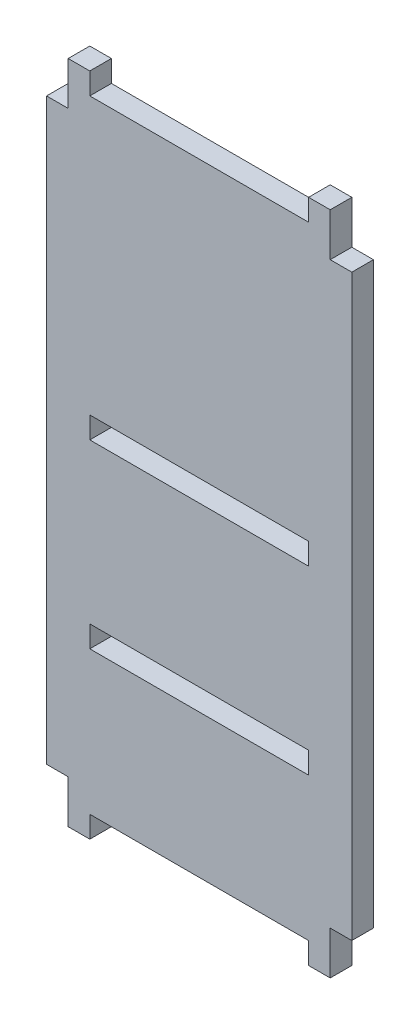
ISO-10303-21;
HEADER;
FILE_DESCRIPTION(('STEP AP214'),'2;1');
FILE_NAME('part.step','',(''),(''),'','','');
FILE_SCHEMA(('AUTOMOTIVE_DESIGN { 1 0 10303 214 1 1 1 1 }'));
ENDSEC;
DATA;
#1=APPLICATION_CONTEXT('core data for automotive mechanical design processes');
#2=APPLICATION_PROTOCOL_DEFINITION('international standard','automotive_design',2000,#1);
#3=PRODUCT_CONTEXT('',#1,'mechanical');
#4=PRODUCT('Part','Part','',(#3));
#5=PRODUCT_RELATED_PRODUCT_CATEGORY('part','',(#4));
#6=PRODUCT_DEFINITION_FORMATION('','',#4);
#7=PRODUCT_DEFINITION_CONTEXT('part definition',#1,'design');
#8=PRODUCT_DEFINITION('design','',#6,#7);
#9=PRODUCT_DEFINITION_SHAPE('','',#8);
#10=(LENGTH_UNIT() NAMED_UNIT(*) SI_UNIT(.MILLI.,.METRE.));
#11=(NAMED_UNIT(*) PLANE_ANGLE_UNIT() SI_UNIT($,.RADIAN.));
#12=(NAMED_UNIT(*) SI_UNIT($,.STERADIAN.) SOLID_ANGLE_UNIT());
#13=UNCERTAINTY_MEASURE_WITH_UNIT(LENGTH_MEASURE(1.E-05),#10,'distance_accuracy_value','');
#14=(GEOMETRIC_REPRESENTATION_CONTEXT(3) GLOBAL_UNCERTAINTY_ASSIGNED_CONTEXT((#13)) GLOBAL_UNIT_ASSIGNED_CONTEXT((#10,
#11,#12)) REPRESENTATION_CONTEXT('',''));
#15=CARTESIAN_POINT('',(0.,0.,0.));
#16=DIRECTION('',(0.,0.,1.));
#17=DIRECTION('',(1.,0.,0.));
#18=AXIS2_PLACEMENT_3D('',#15,#16,#17);
#19=CARTESIAN_POINT('',(0.,0.,6.35));
#20=DIRECTION('',(0.,0.,-1.));
#21=DIRECTION('',(-1.,0.,0.));
#22=AXIS2_PLACEMENT_3D('',#19,#20,#21);
#23=PLANE('',#22);
#24=DIRECTION('',(0.,-1.,0.));
#25=VECTOR('',#24,1.);
#26=CARTESIAN_POINT('',(-35.5219,54.7877999999995,6.35));
#27=LINE('',#26,#25);
#28=CARTESIAN_POINT('',(-35.5219,54.7877999999995,6.35));
#29=VERTEX_POINT('',#28);
#30=CARTESIAN_POINT('',(-35.5219,48.4377999999995,6.35));
#31=VERTEX_POINT('',#30);
#32=EDGE_CURVE('E254',#29,#31,#27,.T.);
#33=ORIENTED_EDGE('',*,*,#32,.F.);
#34=DIRECTION('',(-1.,0.,0.));
#35=VECTOR('',#34,1.);
#36=CARTESIAN_POINT('',(28.7655,54.7877999999995,6.35));
#37=LINE('',#36,#35);
#38=CARTESIAN_POINT('',(28.7655,54.7877999999995,6.35));
#39=VERTEX_POINT('',#38);
#40=EDGE_CURVE('E262',#39,#29,#37,.T.);
#41=ORIENTED_EDGE('',*,*,#40,.F.);
#42=DIRECTION('',(0.,1.,0.));
#43=VECTOR('',#42,1.);
#44=CARTESIAN_POINT('',(28.7655,48.4377999999995,6.35));
#45=LINE('',#44,#43);
#46=CARTESIAN_POINT('',(28.7655,48.4377999999995,6.35));
#47=VERTEX_POINT('',#46);
#48=EDGE_CURVE('E259',#47,#39,#45,.T.);
#49=ORIENTED_EDGE('',*,*,#48,.F.);
#50=DIRECTION('',(1.,0.,0.));
#51=VECTOR('',#50,1.);
#52=CARTESIAN_POINT('',(-35.5219,48.4377999999995,6.35));
#53=LINE('',#52,#51);
#54=EDGE_CURVE('E256',#31,#47,#53,.T.);
#55=ORIENTED_EDGE('',*,*,#54,.F.);
#56=EDGE_LOOP('',(#33,#41,#49,#55));
#57=FACE_BOUND('',#56,.T.);
#58=DIRECTION('',(1.,0.,0.));
#59=VECTOR('',#58,1.);
#60=CARTESIAN_POINT('',(-35.5219,0.,6.35));
#61=LINE('',#60,#59);
#62=CARTESIAN_POINT('',(-41.8719,0.,6.35));
#63=VERTEX_POINT('',#62);
#64=CARTESIAN_POINT('',(-35.5219,0.,6.35));
#65=VERTEX_POINT('',#64);
#66=EDGE_CURVE('E285',#63,#65,#61,.T.);
#67=ORIENTED_EDGE('',*,*,#66,.T.);
#68=DIRECTION('',(0.,1.,0.));
#69=VECTOR('',#68,1.);
#70=CARTESIAN_POINT('',(-35.5219,6.35000000000003,6.35));
#71=LINE('',#70,#69);
#72=CARTESIAN_POINT('',(-35.5219,6.35000000000003,6.35));
#73=VERTEX_POINT('',#72);
#74=EDGE_CURVE('E288',#65,#73,#71,.T.);
#75=ORIENTED_EDGE('',*,*,#74,.T.);
#76=DIRECTION('',(1.,0.,0.));
#77=VECTOR('',#76,1.);
#78=CARTESIAN_POINT('',(28.7655,6.35000000000003,6.35));
#79=LINE('',#78,#77);
#80=CARTESIAN_POINT('',(28.7655,6.35000000000003,6.35));
#81=VERTEX_POINT('',#80);
#82=EDGE_CURVE('E291',#73,#81,#79,.T.);
#83=ORIENTED_EDGE('',*,*,#82,.T.);
#84=DIRECTION('',(0.,-1.,0.));
#85=VECTOR('',#84,1.);
#86=CARTESIAN_POINT('',(28.7655,0.,6.35));
#87=LINE('',#86,#85);
#88=CARTESIAN_POINT('',(28.7655,0.,6.35));
#89=VERTEX_POINT('',#88);
#90=EDGE_CURVE('E293',#81,#89,#87,.T.);
#91=ORIENTED_EDGE('',*,*,#90,.T.);
#92=DIRECTION('',(1.,0.,0.));
#93=VECTOR('',#92,1.);
#94=CARTESIAN_POINT('',(35.1155,0.,6.35));
#95=LINE('',#94,#93);
#96=CARTESIAN_POINT('',(35.1155,0.,6.35));
#97=VERTEX_POINT('',#96);
#98=EDGE_CURVE('E295',#89,#97,#95,.T.);
#99=ORIENTED_EDGE('',*,*,#98,.T.);
#100=DIRECTION('',(0.,1.,0.));
#101=VECTOR('',#100,1.);
#102=CARTESIAN_POINT('',(35.1155,12.6999999999994,6.35));
#103=LINE('',#102,#101);
#104=CARTESIAN_POINT('',(35.1155,12.6999999999994,6.35));
#105=VERTEX_POINT('',#104);
#106=EDGE_CURVE('E297',#97,#105,#103,.T.);
#107=ORIENTED_EDGE('',*,*,#106,.T.);
#108=DIRECTION('',(1.,0.,0.));
#109=VECTOR('',#108,1.);
#110=CARTESIAN_POINT('',(41.4655,12.6999999999994,6.35));
#111=LINE('',#110,#109);
#112=CARTESIAN_POINT('',(41.4655,12.6999999999994,6.35));
#113=VERTEX_POINT('',#112);
#114=EDGE_CURVE('E299',#105,#113,#111,.T.);
#115=ORIENTED_EDGE('',*,*,#114,.T.);
#116=DIRECTION('',(0.,1.,0.));
#117=VECTOR('',#116,1.);
#118=CARTESIAN_POINT('',(41.4655,182.772742274736,6.35));
#119=LINE('',#118,#117);
#120=CARTESIAN_POINT('',(41.4655,182.772742274736,6.35));
#121=VERTEX_POINT('',#120);
#122=EDGE_CURVE('E301',#113,#121,#119,.T.);
#123=ORIENTED_EDGE('',*,*,#122,.T.);
#124=DIRECTION('',(-1.,0.,0.));
#125=VECTOR('',#124,1.);
#126=CARTESIAN_POINT('',(35.1155,182.772742274736,6.35));
#127=LINE('',#126,#125);
#128=CARTESIAN_POINT('',(35.1155,182.772742274736,6.35));
#129=VERTEX_POINT('',#128);
#130=EDGE_CURVE('E303',#121,#129,#127,.T.);
#131=ORIENTED_EDGE('',*,*,#130,.T.);
#132=DIRECTION('',(0.,1.,0.));
#133=VECTOR('',#132,1.);
#134=CARTESIAN_POINT('',(35.1155,195.472742274736,6.35));
#135=LINE('',#134,#133);
#136=CARTESIAN_POINT('',(35.1155,195.472742274736,6.35));
#137=VERTEX_POINT('',#136);
#138=EDGE_CURVE('E305',#129,#137,#135,.T.);
#139=ORIENTED_EDGE('',*,*,#138,.T.);
#140=DIRECTION('',(-1.,0.,0.));
#141=VECTOR('',#140,1.);
#142=CARTESIAN_POINT('',(28.7655,195.472742274736,6.35));
#143=LINE('',#142,#141);
#144=CARTESIAN_POINT('',(28.7655,195.472742274736,6.35));
#145=VERTEX_POINT('',#144);
#146=EDGE_CURVE('E307',#137,#145,#143,.T.);
#147=ORIENTED_EDGE('',*,*,#146,.T.);
#148=DIRECTION('',(0.,-1.,0.));
#149=VECTOR('',#148,1.);
#150=CARTESIAN_POINT('',(28.7655,189.122742274736,6.35));
#151=LINE('',#150,#149);
#152=CARTESIAN_POINT('',(28.7655,189.122742274736,6.35));
#153=VERTEX_POINT('',#152);
#154=EDGE_CURVE('E309',#145,#153,#151,.T.);
#155=ORIENTED_EDGE('',*,*,#154,.T.);
#156=DIRECTION('',(-1.,0.,0.));
#157=VECTOR('',#156,1.);
#158=CARTESIAN_POINT('',(-35.5219,189.122742274736,6.35));
#159=LINE('',#158,#157);
#160=CARTESIAN_POINT('',(-35.5219,189.122742274736,6.35));
#161=VERTEX_POINT('',#160);
#162=EDGE_CURVE('E311',#153,#161,#159,.T.);
#163=ORIENTED_EDGE('',*,*,#162,.T.);
#164=DIRECTION('',(0.,1.,0.));
#165=VECTOR('',#164,1.);
#166=CARTESIAN_POINT('',(-35.5219,195.472742274736,6.35));
#167=LINE('',#166,#165);
#168=CARTESIAN_POINT('',(-35.5219,195.472742274736,6.35));
#169=VERTEX_POINT('',#168);
#170=EDGE_CURVE('E313',#161,#169,#167,.T.);
#171=ORIENTED_EDGE('',*,*,#170,.T.);
#172=DIRECTION('',(-1.,0.,0.));
#173=VECTOR('',#172,1.);
#174=CARTESIAN_POINT('',(-41.8719,195.472742274736,6.35));
#175=LINE('',#174,#173);
#176=CARTESIAN_POINT('',(-41.8719,195.472742274736,6.35));
#177=VERTEX_POINT('',#176);
#178=EDGE_CURVE('E315',#169,#177,#175,.T.);
#179=ORIENTED_EDGE('',*,*,#178,.T.);
#180=DIRECTION('',(0.,-1.,0.));
#181=VECTOR('',#180,1.);
#182=CARTESIAN_POINT('',(-41.8719,182.772742274736,6.35));
#183=LINE('',#182,#181);
#184=CARTESIAN_POINT('',(-41.8719,182.772742274736,6.35));
#185=VERTEX_POINT('',#184);
#186=EDGE_CURVE('E317',#177,#185,#183,.T.);
#187=ORIENTED_EDGE('',*,*,#186,.T.);
#188=DIRECTION('',(-1.,0.,0.));
#189=VECTOR('',#188,1.);
#190=CARTESIAN_POINT('',(-48.2219,182.772742274736,6.35));
#191=LINE('',#190,#189);
#192=CARTESIAN_POINT('',(-48.2219,182.772742274736,6.35));
#193=VERTEX_POINT('',#192);
#194=EDGE_CURVE('E319',#185,#193,#191,.T.);
#195=ORIENTED_EDGE('',*,*,#194,.T.);
#196=DIRECTION('',(0.,-1.,0.));
#197=VECTOR('',#196,1.);
#198=CARTESIAN_POINT('',(-48.2219000000001,12.6999999999994,6.35));
#199=LINE('',#198,#197);
#200=CARTESIAN_POINT('',(-48.2219000000001,12.6999999999994,6.35));
#201=VERTEX_POINT('',#200);
#202=EDGE_CURVE('E321',#193,#201,#199,.T.);
#203=ORIENTED_EDGE('',*,*,#202,.T.);
#204=DIRECTION('',(1.,0.,0.));
#205=VECTOR('',#204,1.);
#206=CARTESIAN_POINT('',(-41.8719000000001,12.6999999999994,6.35));
#207=LINE('',#206,#205);
#208=CARTESIAN_POINT('',(-41.8719000000001,12.6999999999994,6.35));
#209=VERTEX_POINT('',#208);
#210=EDGE_CURVE('E323',#201,#209,#207,.T.);
#211=ORIENTED_EDGE('',*,*,#210,.T.);
#212=DIRECTION('',(0.,-1.,0.));
#213=VECTOR('',#212,1.);
#214=CARTESIAN_POINT('',(-41.8719,0.,6.35));
#215=LINE('',#214,#213);
#216=EDGE_CURVE('E325',#209,#63,#215,.T.);
#217=ORIENTED_EDGE('',*,*,#216,.T.);
#218=EDGE_LOOP('',(#67,#75,#83,#91,#99,#107,#115,#123,#131,#139,#147,#155,#163,#171,#179,#187,
#195,#203,#211,#217));
#219=FACE_BOUND('',#218,.T.);
#220=DIRECTION('',(0.,-1.,0.));
#221=VECTOR('',#220,1.);
#222=CARTESIAN_POINT('',(-35.5219,107.949999999999,6.35));
#223=LINE('',#222,#221);
#224=CARTESIAN_POINT('',(-35.5219,107.949999999999,6.35));
#225=VERTEX_POINT('',#224);
#226=CARTESIAN_POINT('',(-35.5219,101.599999999999,6.35));
#227=VERTEX_POINT('',#226);
#228=EDGE_CURVE('E218',#225,#227,#223,.T.);
#229=ORIENTED_EDGE('',*,*,#228,.F.);
#230=DIRECTION('',(-1.,0.,0.));
#231=VECTOR('',#230,1.);
#232=CARTESIAN_POINT('',(28.7655,107.949999999999,6.35));
#233=LINE('',#232,#231);
#234=CARTESIAN_POINT('',(28.7655,107.949999999999,6.35));
#235=VERTEX_POINT('',#234);
#236=EDGE_CURVE('E240',#235,#225,#233,.T.);
#237=ORIENTED_EDGE('',*,*,#236,.F.);
#238=DIRECTION('',(0.,1.,0.));
#239=VECTOR('',#238,1.);
#240=CARTESIAN_POINT('',(28.7655,101.599999999999,6.35));
#241=LINE('',#240,#239);
#242=CARTESIAN_POINT('',(28.7655,101.599999999999,6.35));
#243=VERTEX_POINT('',#242);
#244=EDGE_CURVE('E238',#243,#235,#241,.T.);
#245=ORIENTED_EDGE('',*,*,#244,.F.);
#246=DIRECTION('',(1.,0.,0.));
#247=VECTOR('',#246,1.);
#248=CARTESIAN_POINT('',(-35.5219,101.599999999999,6.35));
#249=LINE('',#248,#247);
#250=EDGE_CURVE('E226',#227,#243,#249,.T.);
#251=ORIENTED_EDGE('',*,*,#250,.F.);
#252=EDGE_LOOP('',(#229,#237,#245,#251));
#253=FACE_BOUND('',#252,.T.);
#254=ADVANCED_FACE('F33',(#57,#219,#253),#23,.F.);
#255=CARTESIAN_POINT('',(0.,0.,0.));
#256=DIRECTION('',(0.,0.,-1.));
#257=DIRECTION('',(-1.,0.,0.));
#258=AXIS2_PLACEMENT_3D('',#255,#256,#257);
#259=PLANE('',#258);
#260=DIRECTION('',(-1.,0.,0.));
#261=VECTOR('',#260,1.);
#262=CARTESIAN_POINT('',(28.7655,54.7877999999995,0.));
#263=LINE('',#262,#261);
#264=CARTESIAN_POINT('',(28.7655,54.7877999999995,0.));
#265=VERTEX_POINT('',#264);
#266=CARTESIAN_POINT('',(-35.5219,54.7877999999995,0.));
#267=VERTEX_POINT('',#266);
#268=EDGE_CURVE('E257',#265,#267,#263,.T.);
#269=ORIENTED_EDGE('',*,*,#268,.T.);
#270=DIRECTION('',(0.,-1.,0.));
#271=VECTOR('',#270,1.);
#272=CARTESIAN_POINT('',(-35.5219,54.7877999999995,0.));
#273=LINE('',#272,#271);
#274=CARTESIAN_POINT('',(-35.5219,48.4377999999995,0.));
#275=VERTEX_POINT('',#274);
#276=EDGE_CURVE('E234',#267,#275,#273,.T.);
#277=ORIENTED_EDGE('',*,*,#276,.T.);
#278=DIRECTION('',(1.,0.,0.));
#279=VECTOR('',#278,1.);
#280=CARTESIAN_POINT('',(-35.5219,48.4377999999995,0.));
#281=LINE('',#280,#279);
#282=CARTESIAN_POINT('',(28.7655,48.4377999999995,0.));
#283=VERTEX_POINT('',#282);
#284=EDGE_CURVE('E267',#275,#283,#281,.T.);
#285=ORIENTED_EDGE('',*,*,#284,.T.);
#286=DIRECTION('',(0.,1.,0.));
#287=VECTOR('',#286,1.);
#288=CARTESIAN_POINT('',(28.7655,48.4377999999995,0.));
#289=LINE('',#288,#287);
#290=EDGE_CURVE('E270',#283,#265,#289,.T.);
#291=ORIENTED_EDGE('',*,*,#290,.T.);
#292=EDGE_LOOP('',(#269,#277,#285,#291));
#293=FACE_BOUND('',#292,.T.);
#294=DIRECTION('',(1.,0.,0.));
#295=VECTOR('',#294,1.);
#296=CARTESIAN_POINT('',(-35.5219,0.,0.));
#297=LINE('',#296,#295);
#298=CARTESIAN_POINT('',(-41.8719,0.,0.));
#299=VERTEX_POINT('',#298);
#300=CARTESIAN_POINT('',(-35.5219,0.,0.));
#301=VERTEX_POINT('',#300);
#302=EDGE_CURVE('E284',#299,#301,#297,.T.);
#303=ORIENTED_EDGE('',*,*,#302,.F.);
#304=DIRECTION('',(0.,-1.,0.));
#305=VECTOR('',#304,1.);
#306=CARTESIAN_POINT('',(-41.8719,0.,0.));
#307=LINE('',#306,#305);
#308=CARTESIAN_POINT('',(-41.8719000000001,12.6999999999994,0.));
#309=VERTEX_POINT('',#308);
#310=EDGE_CURVE('E289',#309,#299,#307,.T.);
#311=ORIENTED_EDGE('',*,*,#310,.F.);
#312=DIRECTION('',(1.,0.,0.));
#313=VECTOR('',#312,1.);
#314=CARTESIAN_POINT('',(-41.8719000000001,12.6999999999994,0.));
#315=LINE('',#314,#313);
#316=CARTESIAN_POINT('',(-48.2219000000001,12.6999999999994,0.));
#317=VERTEX_POINT('',#316);
#318=EDGE_CURVE('E364',#317,#309,#315,.T.);
#319=ORIENTED_EDGE('',*,*,#318,.F.);
#320=DIRECTION('',(0.,-1.,0.));
#321=VECTOR('',#320,1.);
#322=CARTESIAN_POINT('',(-48.2219000000001,12.6999999999994,0.));
#323=LINE('',#322,#321);
#324=CARTESIAN_POINT('',(-48.2219,182.772742274736,0.));
#325=VERTEX_POINT('',#324);
#326=EDGE_CURVE('E362',#325,#317,#323,.T.);
#327=ORIENTED_EDGE('',*,*,#326,.F.);
#328=DIRECTION('',(-1.,0.,0.));
#329=VECTOR('',#328,1.);
#330=CARTESIAN_POINT('',(-48.2219,182.772742274736,0.));
#331=LINE('',#330,#329);
#332=CARTESIAN_POINT('',(-41.8719,182.772742274736,0.));
#333=VERTEX_POINT('',#332);
#334=EDGE_CURVE('E360',#333,#325,#331,.T.);
#335=ORIENTED_EDGE('',*,*,#334,.F.);
#336=DIRECTION('',(0.,-1.,0.));
#337=VECTOR('',#336,1.);
#338=CARTESIAN_POINT('',(-41.8719,182.772742274736,0.));
#339=LINE('',#338,#337);
#340=CARTESIAN_POINT('',(-41.8719,195.472742274736,0.));
#341=VERTEX_POINT('',#340);
#342=EDGE_CURVE('E358',#341,#333,#339,.T.);
#343=ORIENTED_EDGE('',*,*,#342,.F.);
#344=DIRECTION('',(-1.,0.,0.));
#345=VECTOR('',#344,1.);
#346=CARTESIAN_POINT('',(-41.8719,195.472742274736,0.));
#347=LINE('',#346,#345);
#348=CARTESIAN_POINT('',(-35.5219,195.472742274736,0.));
#349=VERTEX_POINT('',#348);
#350=EDGE_CURVE('E356',#349,#341,#347,.T.);
#351=ORIENTED_EDGE('',*,*,#350,.F.);
#352=DIRECTION('',(0.,1.,0.));
#353=VECTOR('',#352,1.);
#354=CARTESIAN_POINT('',(-35.5219,195.472742274736,0.));
#355=LINE('',#354,#353);
#356=CARTESIAN_POINT('',(-35.5219,189.122742274736,0.));
#357=VERTEX_POINT('',#356);
#358=EDGE_CURVE('E354',#357,#349,#355,.T.);
#359=ORIENTED_EDGE('',*,*,#358,.F.);
#360=DIRECTION('',(-1.,0.,0.));
#361=VECTOR('',#360,1.);
#362=CARTESIAN_POINT('',(-35.5219,189.122742274736,0.));
#363=LINE('',#362,#361);
#364=CARTESIAN_POINT('',(28.7655,189.122742274736,0.));
#365=VERTEX_POINT('',#364);
#366=EDGE_CURVE('E352',#365,#357,#363,.T.);
#367=ORIENTED_EDGE('',*,*,#366,.F.);
#368=DIRECTION('',(0.,-1.,0.));
#369=VECTOR('',#368,1.);
#370=CARTESIAN_POINT('',(28.7655,189.122742274736,0.));
#371=LINE('',#370,#369);
#372=CARTESIAN_POINT('',(28.7655,195.472742274736,0.));
#373=VERTEX_POINT('',#372);
#374=EDGE_CURVE('E350',#373,#365,#371,.T.);
#375=ORIENTED_EDGE('',*,*,#374,.F.);
#376=DIRECTION('',(-1.,0.,0.));
#377=VECTOR('',#376,1.);
#378=CARTESIAN_POINT('',(28.7655,195.472742274736,0.));
#379=LINE('',#378,#377);
#380=CARTESIAN_POINT('',(35.1155,195.472742274736,0.));
#381=VERTEX_POINT('',#380);
#382=EDGE_CURVE('E348',#381,#373,#379,.T.);
#383=ORIENTED_EDGE('',*,*,#382,.F.);
#384=DIRECTION('',(0.,1.,0.));
#385=VECTOR('',#384,1.);
#386=CARTESIAN_POINT('',(35.1155,195.472742274736,0.));
#387=LINE('',#386,#385);
#388=CARTESIAN_POINT('',(35.1155,182.772742274736,0.));
#389=VERTEX_POINT('',#388);
#390=EDGE_CURVE('E346',#389,#381,#387,.T.);
#391=ORIENTED_EDGE('',*,*,#390,.F.);
#392=DIRECTION('',(-1.,0.,0.));
#393=VECTOR('',#392,1.);
#394=CARTESIAN_POINT('',(35.1155,182.772742274736,0.));
#395=LINE('',#394,#393);
#396=CARTESIAN_POINT('',(41.4655,182.772742274736,0.));
#397=VERTEX_POINT('',#396);
#398=EDGE_CURVE('E344',#397,#389,#395,.T.);
#399=ORIENTED_EDGE('',*,*,#398,.F.);
#400=DIRECTION('',(0.,1.,0.));
#401=VECTOR('',#400,1.);
#402=CARTESIAN_POINT('',(41.4655,182.772742274736,0.));
#403=LINE('',#402,#401);
#404=CARTESIAN_POINT('',(41.4655,12.6999999999994,0.));
#405=VERTEX_POINT('',#404);
#406=EDGE_CURVE('E342',#405,#397,#403,.T.);
#407=ORIENTED_EDGE('',*,*,#406,.F.);
#408=DIRECTION('',(1.,0.,0.));
#409=VECTOR('',#408,1.);
#410=CARTESIAN_POINT('',(41.4655,12.6999999999994,0.));
#411=LINE('',#410,#409);
#412=CARTESIAN_POINT('',(35.1155,12.6999999999994,0.));
#413=VERTEX_POINT('',#412);
#414=EDGE_CURVE('E340',#413,#405,#411,.T.);
#415=ORIENTED_EDGE('',*,*,#414,.F.);
#416=DIRECTION('',(0.,1.,0.));
#417=VECTOR('',#416,1.);
#418=CARTESIAN_POINT('',(35.1155,12.6999999999994,0.));
#419=LINE('',#418,#417);
#420=CARTESIAN_POINT('',(35.1155,0.,0.));
#421=VERTEX_POINT('',#420);
#422=EDGE_CURVE('E338',#421,#413,#419,.T.);
#423=ORIENTED_EDGE('',*,*,#422,.F.);
#424=DIRECTION('',(1.,0.,0.));
#425=VECTOR('',#424,1.);
#426=CARTESIAN_POINT('',(35.1155,0.,0.));
#427=LINE('',#426,#425);
#428=CARTESIAN_POINT('',(28.7655,0.,0.));
#429=VERTEX_POINT('',#428);
#430=EDGE_CURVE('E336',#429,#421,#427,.T.);
#431=ORIENTED_EDGE('',*,*,#430,.F.);
#432=DIRECTION('',(0.,-1.,0.));
#433=VECTOR('',#432,1.);
#434=CARTESIAN_POINT('',(28.7655,0.,0.));
#435=LINE('',#434,#433);
#436=CARTESIAN_POINT('',(28.7655,6.35000000000003,0.));
#437=VERTEX_POINT('',#436);
#438=EDGE_CURVE('E334',#437,#429,#435,.T.);
#439=ORIENTED_EDGE('',*,*,#438,.F.);
#440=DIRECTION('',(1.,0.,0.));
#441=VECTOR('',#440,1.);
#442=CARTESIAN_POINT('',(28.7655,6.35000000000003,0.));
#443=LINE('',#442,#441);
#444=CARTESIAN_POINT('',(-35.5219,6.35000000000003,0.));
#445=VERTEX_POINT('',#444);
#446=EDGE_CURVE('E332',#445,#437,#443,.T.);
#447=ORIENTED_EDGE('',*,*,#446,.F.);
#448=DIRECTION('',(0.,1.,0.));
#449=VECTOR('',#448,1.);
#450=CARTESIAN_POINT('',(-35.5219,6.35000000000003,0.));
#451=LINE('',#450,#449);
#452=EDGE_CURVE('E330',#301,#445,#451,.T.);
#453=ORIENTED_EDGE('',*,*,#452,.F.);
#454=EDGE_LOOP('',(#303,#311,#319,#327,#335,#343,#351,#359,#367,#375,#383,#391,#399,#407,#415,
#423,#431,#439,#447,#453));
#455=FACE_BOUND('',#454,.T.);
#456=DIRECTION('',(-1.,0.,0.));
#457=VECTOR('',#456,1.);
#458=CARTESIAN_POINT('',(28.7655,107.949999999999,0.));
#459=LINE('',#458,#457);
#460=CARTESIAN_POINT('',(28.7655,107.949999999999,0.));
#461=VERTEX_POINT('',#460);
#462=CARTESIAN_POINT('',(-35.5219,107.949999999999,0.));
#463=VERTEX_POINT('',#462);
#464=EDGE_CURVE('E227',#461,#463,#459,.T.);
#465=ORIENTED_EDGE('',*,*,#464,.T.);
#466=DIRECTION('',(0.,-1.,0.));
#467=VECTOR('',#466,1.);
#468=CARTESIAN_POINT('',(-35.5219,107.949999999999,0.));
#469=LINE('',#468,#467);
#470=CARTESIAN_POINT('',(-35.5219,101.599999999999,0.));
#471=VERTEX_POINT('',#470);
#472=EDGE_CURVE('E56',#463,#471,#469,.T.);
#473=ORIENTED_EDGE('',*,*,#472,.T.);
#474=DIRECTION('',(1.,0.,0.));
#475=VECTOR('',#474,1.);
#476=CARTESIAN_POINT('',(-35.5219,101.599999999999,0.));
#477=LINE('',#476,#475);
#478=CARTESIAN_POINT('',(28.7655,101.599999999999,0.));
#479=VERTEX_POINT('',#478);
#480=EDGE_CURVE('E233',#471,#479,#477,.T.);
#481=ORIENTED_EDGE('',*,*,#480,.T.);
#482=DIRECTION('',(0.,1.,0.));
#483=VECTOR('',#482,1.);
#484=CARTESIAN_POINT('',(28.7655,101.599999999999,0.));
#485=LINE('',#484,#483);
#486=EDGE_CURVE('E246',#479,#461,#485,.T.);
#487=ORIENTED_EDGE('',*,*,#486,.T.);
#488=EDGE_LOOP('',(#465,#473,#481,#487));
#489=FACE_BOUND('',#488,.T.);
#490=ADVANCED_FACE('F430',(#293,#455,#489),#259,.T.);
#491=CARTESIAN_POINT('',(-35.5219,0.,6.35));
#492=DIRECTION('',(0.,1.,0.));
#493=DIRECTION('',(-1.,0.,0.));
#494=AXIS2_PLACEMENT_3D('',#491,#492,#493);
#495=PLANE('',#494);
#496=ORIENTED_EDGE('',*,*,#302,.T.);
#497=DIRECTION('',(0.,0.,-1.));
#498=VECTOR('',#497,1.);
#499=CARTESIAN_POINT('',(-35.5219,0.,6.35));
#500=LINE('',#499,#498);
#501=EDGE_CURVE('E11',#65,#301,#500,.T.);
#502=ORIENTED_EDGE('',*,*,#501,.F.);
#503=ORIENTED_EDGE('',*,*,#66,.F.);
#504=DIRECTION('',(0.,0.,-1.));
#505=VECTOR('',#504,1.);
#506=CARTESIAN_POINT('',(-41.8719,0.,6.35));
#507=LINE('',#506,#505);
#508=EDGE_CURVE('E327',#63,#299,#507,.T.);
#509=ORIENTED_EDGE('',*,*,#508,.T.);
#510=EDGE_LOOP('',(#496,#502,#503,#509));
#511=FACE_BOUND('',#510,.T.);
#512=ADVANCED_FACE('F35',(#511),#495,.F.);
#513=CARTESIAN_POINT('',(-35.5219,6.35000000000003,6.35));
#514=DIRECTION('',(-1.,0.,0.));
#515=DIRECTION('',(0.,0.,1.));
#516=AXIS2_PLACEMENT_3D('',#513,#514,#515);
#517=PLANE('',#516);
#518=ORIENTED_EDGE('',*,*,#452,.T.);
#519=DIRECTION('',(0.,0.,-1.));
#520=VECTOR('',#519,1.);
#521=CARTESIAN_POINT('',(-35.5219,6.35000000000003,6.35));
#522=LINE('',#521,#520);
#523=EDGE_CURVE('E41',#73,#445,#522,.T.);
#524=ORIENTED_EDGE('',*,*,#523,.F.);
#525=ORIENTED_EDGE('',*,*,#74,.F.);
#526=ORIENTED_EDGE('',*,*,#501,.T.);
#527=EDGE_LOOP('',(#518,#524,#525,#526));
#528=FACE_BOUND('',#527,.T.);
#529=ADVANCED_FACE('F447',(#528),#517,.F.);
#530=CARTESIAN_POINT('',(28.7655,6.35000000000003,6.35));
#531=DIRECTION('',(0.,1.,0.));
#532=DIRECTION('',(0.,0.,1.));
#533=AXIS2_PLACEMENT_3D('',#530,#531,#532);
#534=PLANE('',#533);
#535=ORIENTED_EDGE('',*,*,#446,.T.);
#536=DIRECTION('',(0.,0.,-1.));
#537=VECTOR('',#536,1.);
#538=CARTESIAN_POINT('',(28.7655,6.35000000000003,6.35));
#539=LINE('',#538,#537);
#540=EDGE_CURVE('E417',#81,#437,#539,.T.);
#541=ORIENTED_EDGE('',*,*,#540,.F.);
#542=ORIENTED_EDGE('',*,*,#82,.F.);
#543=ORIENTED_EDGE('',*,*,#523,.T.);
#544=EDGE_LOOP('',(#535,#541,#542,#543));
#545=FACE_BOUND('',#544,.T.);
#546=ADVANCED_FACE('F424',(#545),#534,.F.);
#547=CARTESIAN_POINT('',(28.7655,0.,6.35));
#548=DIRECTION('',(1.,0.,0.));
#549=DIRECTION('',(0.,0.,-1.));
#550=AXIS2_PLACEMENT_3D('',#547,#548,#549);
#551=PLANE('',#550);
#552=ORIENTED_EDGE('',*,*,#438,.T.);
#553=DIRECTION('',(0.,0.,-1.));
#554=VECTOR('',#553,1.);
#555=CARTESIAN_POINT('',(28.7655,0.,6.35));
#556=LINE('',#555,#554);
#557=EDGE_CURVE('E414',#89,#429,#556,.T.);
#558=ORIENTED_EDGE('',*,*,#557,.F.);
#559=ORIENTED_EDGE('',*,*,#90,.F.);
#560=ORIENTED_EDGE('',*,*,#540,.T.);
#561=EDGE_LOOP('',(#552,#558,#559,#560));
#562=FACE_BOUND('',#561,.T.);
#563=ADVANCED_FACE('F436',(#562),#551,.F.);
#564=CARTESIAN_POINT('',(35.1155,0.,6.35));
#565=DIRECTION('',(0.,1.,0.));
#566=DIRECTION('',(0.,0.,1.));
#567=AXIS2_PLACEMENT_3D('',#564,#565,#566);
#568=PLANE('',#567);
#569=ORIENTED_EDGE('',*,*,#430,.T.);
#570=DIRECTION('',(0.,0.,-1.));
#571=VECTOR('',#570,1.);
#572=CARTESIAN_POINT('',(35.1155,0.,6.35));
#573=LINE('',#572,#571);
#574=EDGE_CURVE('E411',#97,#421,#573,.T.);
#575=ORIENTED_EDGE('',*,*,#574,.F.);
#576=ORIENTED_EDGE('',*,*,#98,.F.);
#577=ORIENTED_EDGE('',*,*,#557,.T.);
#578=EDGE_LOOP('',(#569,#575,#576,#577));
#579=FACE_BOUND('',#578,.T.);
#580=ADVANCED_FACE('F440',(#579),#568,.F.);
#581=CARTESIAN_POINT('',(35.1155,12.6999999999994,6.35));
#582=DIRECTION('',(-1.,0.,0.));
#583=DIRECTION('',(0.,0.,1.));
#584=AXIS2_PLACEMENT_3D('',#581,#582,#583);
#585=PLANE('',#584);
#586=ORIENTED_EDGE('',*,*,#422,.T.);
#587=DIRECTION('',(0.,0.,-1.));
#588=VECTOR('',#587,1.);
#589=CARTESIAN_POINT('',(35.1155,12.6999999999994,6.35));
#590=LINE('',#589,#588);
#591=EDGE_CURVE('E408',#105,#413,#590,.T.);
#592=ORIENTED_EDGE('',*,*,#591,.F.);
#593=ORIENTED_EDGE('',*,*,#106,.F.);
#594=ORIENTED_EDGE('',*,*,#574,.T.);
#595=EDGE_LOOP('',(#586,#592,#593,#594));
#596=FACE_BOUND('',#595,.T.);
#597=ADVANCED_FACE('F520',(#596),#585,.F.);
#598=CARTESIAN_POINT('',(41.4655,12.6999999999994,6.35));
#599=DIRECTION('',(0.,1.,0.));
#600=DIRECTION('',(0.,0.,1.));
#601=AXIS2_PLACEMENT_3D('',#598,#599,#600);
#602=PLANE('',#601);
#603=ORIENTED_EDGE('',*,*,#414,.T.);
#604=DIRECTION('',(0.,0.,-1.));
#605=VECTOR('',#604,1.);
#606=CARTESIAN_POINT('',(41.4655,12.6999999999994,6.35));
#607=LINE('',#606,#605);
#608=EDGE_CURVE('E405',#113,#405,#607,.T.);
#609=ORIENTED_EDGE('',*,*,#608,.F.);
#610=ORIENTED_EDGE('',*,*,#114,.F.);
#611=ORIENTED_EDGE('',*,*,#591,.T.);
#612=EDGE_LOOP('',(#603,#609,#610,#611));
#613=FACE_BOUND('',#612,.T.);
#614=ADVANCED_FACE('F518',(#613),#602,.F.);
#615=CARTESIAN_POINT('',(41.4655,182.772742274736,6.35));
#616=DIRECTION('',(-1.,0.,0.));
#617=DIRECTION('',(0.,-1.,0.));
#618=AXIS2_PLACEMENT_3D('',#615,#616,#617);
#619=PLANE('',#618);
#620=ORIENTED_EDGE('',*,*,#406,.T.);
#621=DIRECTION('',(0.,0.,-1.));
#622=VECTOR('',#621,1.);
#623=CARTESIAN_POINT('',(41.4655,182.772742274736,6.35));
#624=LINE('',#623,#622);
#625=EDGE_CURVE('E402',#121,#397,#624,.T.);
#626=ORIENTED_EDGE('',*,*,#625,.F.);
#627=ORIENTED_EDGE('',*,*,#122,.F.);
#628=ORIENTED_EDGE('',*,*,#608,.T.);
#629=EDGE_LOOP('',(#620,#626,#627,#628));
#630=FACE_BOUND('',#629,.T.);
#631=ADVANCED_FACE('F513',(#630),#619,.F.);
#632=CARTESIAN_POINT('',(35.1155,182.772742274736,6.35));
#633=DIRECTION('',(0.,-1.,0.));
#634=DIRECTION('',(0.,0.,-1.));
#635=AXIS2_PLACEMENT_3D('',#632,#633,#634);
#636=PLANE('',#635);
#637=ORIENTED_EDGE('',*,*,#398,.T.);
#638=DIRECTION('',(0.,0.,-1.));
#639=VECTOR('',#638,1.);
#640=CARTESIAN_POINT('',(35.1155,182.772742274736,6.35));
#641=LINE('',#640,#639);
#642=EDGE_CURVE('E399',#129,#389,#641,.T.);
#643=ORIENTED_EDGE('',*,*,#642,.F.);
#644=ORIENTED_EDGE('',*,*,#130,.F.);
#645=ORIENTED_EDGE('',*,*,#625,.T.);
#646=EDGE_LOOP('',(#637,#643,#644,#645));
#647=FACE_BOUND('',#646,.T.);
#648=ADVANCED_FACE('F508',(#647),#636,.F.);
#649=CARTESIAN_POINT('',(35.1155,195.472742274736,6.35));
#650=DIRECTION('',(-1.,0.,0.));
#651=DIRECTION('',(0.,-1.,0.));
#652=AXIS2_PLACEMENT_3D('',#649,#650,#651);
#653=PLANE('',#652);
#654=ORIENTED_EDGE('',*,*,#390,.T.);
#655=DIRECTION('',(0.,0.,-1.));
#656=VECTOR('',#655,1.);
#657=CARTESIAN_POINT('',(35.1155,195.472742274736,6.35));
#658=LINE('',#657,#656);
#659=EDGE_CURVE('E396',#137,#381,#658,.T.);
#660=ORIENTED_EDGE('',*,*,#659,.F.);
#661=ORIENTED_EDGE('',*,*,#138,.F.);
#662=ORIENTED_EDGE('',*,*,#642,.T.);
#663=EDGE_LOOP('',(#654,#660,#661,#662));
#664=FACE_BOUND('',#663,.T.);
#665=ADVANCED_FACE('F504',(#664),#653,.F.);
#666=CARTESIAN_POINT('',(28.7655,195.472742274736,6.35));
#667=DIRECTION('',(0.,-1.,0.));
#668=DIRECTION('',(0.,0.,-1.));
#669=AXIS2_PLACEMENT_3D('',#666,#667,#668);
#670=PLANE('',#669);
#671=ORIENTED_EDGE('',*,*,#382,.T.);
#672=DIRECTION('',(0.,0.,-1.));
#673=VECTOR('',#672,1.);
#674=CARTESIAN_POINT('',(28.7655,195.472742274736,6.35));
#675=LINE('',#674,#673);
#676=EDGE_CURVE('E393',#145,#373,#675,.T.);
#677=ORIENTED_EDGE('',*,*,#676,.F.);
#678=ORIENTED_EDGE('',*,*,#146,.F.);
#679=ORIENTED_EDGE('',*,*,#659,.T.);
#680=EDGE_LOOP('',(#671,#677,#678,#679));
#681=FACE_BOUND('',#680,.T.);
#682=ADVANCED_FACE('F499',(#681),#670,.F.);
#683=CARTESIAN_POINT('',(28.7655,189.122742274736,6.35));
#684=DIRECTION('',(1.,0.,0.));
#685=DIRECTION('',(0.,0.,-1.));
#686=AXIS2_PLACEMENT_3D('',#683,#684,#685);
#687=PLANE('',#686);
#688=ORIENTED_EDGE('',*,*,#374,.T.);
#689=DIRECTION('',(0.,0.,-1.));
#690=VECTOR('',#689,1.);
#691=CARTESIAN_POINT('',(28.7655,189.122742274736,6.35));
#692=LINE('',#691,#690);
#693=EDGE_CURVE('E390',#153,#365,#692,.T.);
#694=ORIENTED_EDGE('',*,*,#693,.F.);
#695=ORIENTED_EDGE('',*,*,#154,.F.);
#696=ORIENTED_EDGE('',*,*,#676,.T.);
#697=EDGE_LOOP('',(#688,#694,#695,#696));
#698=FACE_BOUND('',#697,.T.);
#699=ADVANCED_FACE('F493',(#698),#687,.F.);
#700=CARTESIAN_POINT('',(-35.5219,189.122742274736,6.35));
#701=DIRECTION('',(0.,-1.,0.));
#702=DIRECTION('',(0.,0.,-1.));
#703=AXIS2_PLACEMENT_3D('',#700,#701,#702);
#704=PLANE('',#703);
#705=ORIENTED_EDGE('',*,*,#366,.T.);
#706=DIRECTION('',(0.,0.,-1.));
#707=VECTOR('',#706,1.);
#708=CARTESIAN_POINT('',(-35.5219,189.122742274736,6.35));
#709=LINE('',#708,#707);
#710=EDGE_CURVE('E387',#161,#357,#709,.T.);
#711=ORIENTED_EDGE('',*,*,#710,.F.);
#712=ORIENTED_EDGE('',*,*,#162,.F.);
#713=ORIENTED_EDGE('',*,*,#693,.T.);
#714=EDGE_LOOP('',(#705,#711,#712,#713));
#715=FACE_BOUND('',#714,.T.);
#716=ADVANCED_FACE('F489',(#715),#704,.F.);
#717=CARTESIAN_POINT('',(-35.5219,195.472742274736,6.35));
#718=DIRECTION('',(-1.,0.,0.));
#719=DIRECTION('',(0.,0.,1.));
#720=AXIS2_PLACEMENT_3D('',#717,#718,#719);
#721=PLANE('',#720);
#722=ORIENTED_EDGE('',*,*,#358,.T.);
#723=DIRECTION('',(0.,0.,-1.));
#724=VECTOR('',#723,1.);
#725=CARTESIAN_POINT('',(-35.5219,195.472742274736,6.35));
#726=LINE('',#725,#724);
#727=EDGE_CURVE('E384',#169,#349,#726,.T.);
#728=ORIENTED_EDGE('',*,*,#727,.F.);
#729=ORIENTED_EDGE('',*,*,#170,.F.);
#730=ORIENTED_EDGE('',*,*,#710,.T.);
#731=EDGE_LOOP('',(#722,#728,#729,#730));
#732=FACE_BOUND('',#731,.T.);
#733=ADVANCED_FACE('F484',(#732),#721,.F.);
#734=CARTESIAN_POINT('',(-41.8719,195.472742274736,6.35));
#735=DIRECTION('',(0.,-1.,0.));
#736=DIRECTION('',(0.,0.,-1.));
#737=AXIS2_PLACEMENT_3D('',#734,#735,#736);
#738=PLANE('',#737);
#739=ORIENTED_EDGE('',*,*,#350,.T.);
#740=DIRECTION('',(0.,0.,-1.));
#741=VECTOR('',#740,1.);
#742=CARTESIAN_POINT('',(-41.8719,195.472742274736,6.35));
#743=LINE('',#742,#741);
#744=EDGE_CURVE('E381',#177,#341,#743,.T.);
#745=ORIENTED_EDGE('',*,*,#744,.F.);
#746=ORIENTED_EDGE('',*,*,#178,.F.);
#747=ORIENTED_EDGE('',*,*,#727,.T.);
#748=EDGE_LOOP('',(#739,#745,#746,#747));
#749=FACE_BOUND('',#748,.T.);
#750=ADVANCED_FACE('F478',(#749),#738,.F.);
#751=CARTESIAN_POINT('',(-41.8719,182.772742274736,6.35));
#752=DIRECTION('',(1.,0.,0.));
#753=DIRECTION('',(0.,0.,-1.));
#754=AXIS2_PLACEMENT_3D('',#751,#752,#753);
#755=PLANE('',#754);
#756=ORIENTED_EDGE('',*,*,#342,.T.);
#757=DIRECTION('',(0.,0.,-1.));
#758=VECTOR('',#757,1.);
#759=CARTESIAN_POINT('',(-41.8719,182.772742274736,6.35));
#760=LINE('',#759,#758);
#761=EDGE_CURVE('E378',#185,#333,#760,.T.);
#762=ORIENTED_EDGE('',*,*,#761,.F.);
#763=ORIENTED_EDGE('',*,*,#186,.F.);
#764=ORIENTED_EDGE('',*,*,#744,.T.);
#765=EDGE_LOOP('',(#756,#762,#763,#764));
#766=FACE_BOUND('',#765,.T.);
#767=ADVANCED_FACE('F474',(#766),#755,.F.);
#768=CARTESIAN_POINT('',(-48.2219,182.772742274736,6.35));
#769=DIRECTION('',(0.,-1.,0.));
#770=DIRECTION('',(0.,0.,-1.));
#771=AXIS2_PLACEMENT_3D('',#768,#769,#770);
#772=PLANE('',#771);
#773=ORIENTED_EDGE('',*,*,#334,.T.);
#774=DIRECTION('',(0.,0.,-1.));
#775=VECTOR('',#774,1.);
#776=CARTESIAN_POINT('',(-48.2219,182.772742274736,6.35));
#777=LINE('',#776,#775);
#778=EDGE_CURVE('E375',#193,#325,#777,.T.);
#779=ORIENTED_EDGE('',*,*,#778,.F.);
#780=ORIENTED_EDGE('',*,*,#194,.F.);
#781=ORIENTED_EDGE('',*,*,#761,.T.);
#782=EDGE_LOOP('',(#773,#779,#780,#781));
#783=FACE_BOUND('',#782,.T.);
#784=ADVANCED_FACE('F469',(#783),#772,.F.);
#785=CARTESIAN_POINT('',(-48.2219000000001,12.6999999999994,6.35));
#786=DIRECTION('',(1.,0.,0.));
#787=DIRECTION('',(0.,1.,0.));
#788=AXIS2_PLACEMENT_3D('',#785,#786,#787);
#789=PLANE('',#788);
#790=ORIENTED_EDGE('',*,*,#326,.T.);
#791=DIRECTION('',(0.,0.,-1.));
#792=VECTOR('',#791,1.);
#793=CARTESIAN_POINT('',(-48.2219000000001,12.6999999999994,6.35));
#794=LINE('',#793,#792);
#795=EDGE_CURVE('E372',#201,#317,#794,.T.);
#796=ORIENTED_EDGE('',*,*,#795,.F.);
#797=ORIENTED_EDGE('',*,*,#202,.F.);
#798=ORIENTED_EDGE('',*,*,#778,.T.);
#799=EDGE_LOOP('',(#790,#796,#797,#798));
#800=FACE_BOUND('',#799,.T.);
#801=ADVANCED_FACE('F463',(#800),#789,.F.);
#802=CARTESIAN_POINT('',(-41.8719000000001,12.6999999999994,6.35));
#803=DIRECTION('',(0.,1.,0.));
#804=DIRECTION('',(-1.,0.,0.));
#805=AXIS2_PLACEMENT_3D('',#802,#803,#804);
#806=PLANE('',#805);
#807=ORIENTED_EDGE('',*,*,#318,.T.);
#808=DIRECTION('',(0.,0.,-1.));
#809=VECTOR('',#808,1.);
#810=CARTESIAN_POINT('',(-41.8719000000001,12.6999999999994,6.35));
#811=LINE('',#810,#809);
#812=EDGE_CURVE('E369',#209,#309,#811,.T.);
#813=ORIENTED_EDGE('',*,*,#812,.F.);
#814=ORIENTED_EDGE('',*,*,#210,.F.);
#815=ORIENTED_EDGE('',*,*,#795,.T.);
#816=EDGE_LOOP('',(#807,#813,#814,#815));
#817=FACE_BOUND('',#816,.T.);
#818=ADVANCED_FACE('F459',(#817),#806,.F.);
#819=CARTESIAN_POINT('',(-41.8719,0.,6.35));
#820=DIRECTION('',(1.,0.,0.));
#821=DIRECTION('',(0.,1.,0.));
#822=AXIS2_PLACEMENT_3D('',#819,#820,#821);
#823=PLANE('',#822);
#824=ORIENTED_EDGE('',*,*,#310,.T.);
#825=ORIENTED_EDGE('',*,*,#508,.F.);
#826=ORIENTED_EDGE('',*,*,#216,.F.);
#827=ORIENTED_EDGE('',*,*,#812,.T.);
#828=EDGE_LOOP('',(#824,#825,#826,#827));
#829=FACE_BOUND('',#828,.T.);
#830=ADVANCED_FACE('F454',(#829),#823,.F.);
#831=CARTESIAN_POINT('',(-35.5219,54.7877999999995,6.35));
#832=DIRECTION('',(1.,0.,0.));
#833=DIRECTION('',(0.,0.,-1.));
#834=AXIS2_PLACEMENT_3D('',#831,#832,#833);
#835=PLANE('',#834);
#836=ORIENTED_EDGE('',*,*,#276,.F.);
#837=DIRECTION('',(0.,0.,-1.));
#838=VECTOR('',#837,1.);
#839=CARTESIAN_POINT('',(-35.5219,54.7877999999995,6.35));
#840=LINE('',#839,#838);
#841=EDGE_CURVE('E264',#29,#267,#840,.T.);
#842=ORIENTED_EDGE('',*,*,#841,.F.);
#843=ORIENTED_EDGE('',*,*,#32,.T.);
#844=DIRECTION('',(0.,0.,-1.));
#845=VECTOR('',#844,1.);
#846=CARTESIAN_POINT('',(-35.5219,48.4377999999995,6.35));
#847=LINE('',#846,#845);
#848=EDGE_CURVE('E281',#31,#275,#847,.T.);
#849=ORIENTED_EDGE('',*,*,#848,.T.);
#850=EDGE_LOOP('',(#836,#842,#843,#849));
#851=FACE_BOUND('',#850,.T.);
#852=ADVANCED_FACE('F539',(#851),#835,.T.);
#853=CARTESIAN_POINT('',(-35.5219,48.4377999999995,6.35));
#854=DIRECTION('',(0.,1.,0.));
#855=DIRECTION('',(0.,0.,1.));
#856=AXIS2_PLACEMENT_3D('',#853,#854,#855);
#857=PLANE('',#856);
#858=ORIENTED_EDGE('',*,*,#284,.F.);
#859=ORIENTED_EDGE('',*,*,#848,.F.);
#860=ORIENTED_EDGE('',*,*,#54,.T.);
#861=DIRECTION('',(0.,0.,-1.));
#862=VECTOR('',#861,1.);
#863=CARTESIAN_POINT('',(28.7655,48.4377999999995,6.35));
#864=LINE('',#863,#862);
#865=EDGE_CURVE('E279',#47,#283,#864,.T.);
#866=ORIENTED_EDGE('',*,*,#865,.T.);
#867=EDGE_LOOP('',(#858,#859,#860,#866));
#868=FACE_BOUND('',#867,.T.);
#869=ADVANCED_FACE('F625',(#868),#857,.T.);
#870=CARTESIAN_POINT('',(28.7655,48.4377999999995,6.35));
#871=DIRECTION('',(-1.,0.,0.));
#872=DIRECTION('',(0.,0.,1.));
#873=AXIS2_PLACEMENT_3D('',#870,#871,#872);
#874=PLANE('',#873);
#875=ORIENTED_EDGE('',*,*,#290,.F.);
#876=ORIENTED_EDGE('',*,*,#865,.F.);
#877=ORIENTED_EDGE('',*,*,#48,.T.);
#878=DIRECTION('',(0.,0.,-1.));
#879=VECTOR('',#878,1.);
#880=CARTESIAN_POINT('',(28.7655,54.7877999999995,6.35));
#881=LINE('',#880,#879);
#882=EDGE_CURVE('E277',#39,#265,#881,.T.);
#883=ORIENTED_EDGE('',*,*,#882,.T.);
#884=EDGE_LOOP('',(#875,#876,#877,#883));
#885=FACE_BOUND('',#884,.T.);
#886=ADVANCED_FACE('F632',(#885),#874,.T.);
#887=CARTESIAN_POINT('',(28.7655,54.7877999999995,6.35));
#888=DIRECTION('',(0.,-1.,0.));
#889=DIRECTION('',(0.,0.,-1.));
#890=AXIS2_PLACEMENT_3D('',#887,#888,#889);
#891=PLANE('',#890);
#892=ORIENTED_EDGE('',*,*,#268,.F.);
#893=ORIENTED_EDGE('',*,*,#882,.F.);
#894=ORIENTED_EDGE('',*,*,#40,.T.);
#895=ORIENTED_EDGE('',*,*,#841,.T.);
#896=EDGE_LOOP('',(#892,#893,#894,#895));
#897=FACE_BOUND('',#896,.T.);
#898=ADVANCED_FACE('F639',(#897),#891,.T.);
#899=CARTESIAN_POINT('',(-35.5219,107.949999999999,6.35));
#900=DIRECTION('',(1.,0.,0.));
#901=DIRECTION('',(0.,0.,-1.));
#902=AXIS2_PLACEMENT_3D('',#899,#900,#901);
#903=PLANE('',#902);
#904=ORIENTED_EDGE('',*,*,#472,.F.);
#905=DIRECTION('',(0.,0.,-1.));
#906=VECTOR('',#905,1.);
#907=CARTESIAN_POINT('',(-35.5219,107.949999999999,6.35));
#908=LINE('',#907,#906);
#909=EDGE_CURVE('E222',#225,#463,#908,.T.);
#910=ORIENTED_EDGE('',*,*,#909,.F.);
#911=ORIENTED_EDGE('',*,*,#228,.T.);
#912=DIRECTION('',(0.,0.,-1.));
#913=VECTOR('',#912,1.);
#914=CARTESIAN_POINT('',(-35.5219,101.599999999999,6.35));
#915=LINE('',#914,#913);
#916=EDGE_CURVE('E221',#227,#471,#915,.T.);
#917=ORIENTED_EDGE('',*,*,#916,.T.);
#918=EDGE_LOOP('',(#904,#910,#911,#917));
#919=FACE_BOUND('',#918,.T.);
#920=ADVANCED_FACE('F220',(#919),#903,.T.);
#921=CARTESIAN_POINT('',(-35.5219,101.599999999999,6.35));
#922=DIRECTION('',(0.,1.,0.));
#923=DIRECTION('',(0.,0.,1.));
#924=AXIS2_PLACEMENT_3D('',#921,#922,#923);
#925=PLANE('',#924);
#926=ORIENTED_EDGE('',*,*,#480,.F.);
#927=ORIENTED_EDGE('',*,*,#916,.F.);
#928=ORIENTED_EDGE('',*,*,#250,.T.);
#929=DIRECTION('',(0.,0.,-1.));
#930=VECTOR('',#929,1.);
#931=CARTESIAN_POINT('',(28.7655,101.599999999999,6.35));
#932=LINE('',#931,#930);
#933=EDGE_CURVE('E235',#243,#479,#932,.T.);
#934=ORIENTED_EDGE('',*,*,#933,.T.);
#935=EDGE_LOOP('',(#926,#927,#928,#934));
#936=FACE_BOUND('',#935,.T.);
#937=ADVANCED_FACE('F230',(#936),#925,.T.);
#938=CARTESIAN_POINT('',(28.7655,101.599999999999,6.35));
#939=DIRECTION('',(-1.,0.,0.));
#940=DIRECTION('',(0.,0.,1.));
#941=AXIS2_PLACEMENT_3D('',#938,#939,#940);
#942=PLANE('',#941);
#943=ORIENTED_EDGE('',*,*,#486,.F.);
#944=ORIENTED_EDGE('',*,*,#933,.F.);
#945=ORIENTED_EDGE('',*,*,#244,.T.);
#946=DIRECTION('',(0.,0.,-1.));
#947=VECTOR('',#946,1.);
#948=CARTESIAN_POINT('',(28.7655,107.949999999999,6.35));
#949=LINE('',#948,#947);
#950=EDGE_CURVE('E48',#235,#461,#949,.T.);
#951=ORIENTED_EDGE('',*,*,#950,.T.);
#952=EDGE_LOOP('',(#943,#944,#945,#951));
#953=FACE_BOUND('',#952,.T.);
#954=ADVANCED_FACE('F660',(#953),#942,.T.);
#955=CARTESIAN_POINT('',(28.7655,107.949999999999,6.35));
#956=DIRECTION('',(0.,-1.,0.));
#957=DIRECTION('',(0.,0.,-1.));
#958=AXIS2_PLACEMENT_3D('',#955,#956,#957);
#959=PLANE('',#958);
#960=ORIENTED_EDGE('',*,*,#464,.F.);
#961=ORIENTED_EDGE('',*,*,#950,.F.);
#962=ORIENTED_EDGE('',*,*,#236,.T.);
#963=ORIENTED_EDGE('',*,*,#909,.T.);
#964=EDGE_LOOP('',(#960,#961,#962,#963));
#965=FACE_BOUND('',#964,.T.);
#966=ADVANCED_FACE('F667',(#965),#959,.T.);
#967=CLOSED_SHELL('',(#254,#490,#512,#529,#546,#563,#580,#597,#614,#631,#648,#665,#682,#699,
#716,#733,#750,#767,#784,#801,#818,#830,#852,#869,#886,#898,#920,#937,#954,#966));
#968=MANIFOLD_SOLID_BREP('B2',#967);
#969=ADVANCED_BREP_SHAPE_REPRESENTATION('',(#18,#968),#14);
#970=SHAPE_DEFINITION_REPRESENTATION(#9,#969);
ENDSEC;
END-ISO-10303-21;
